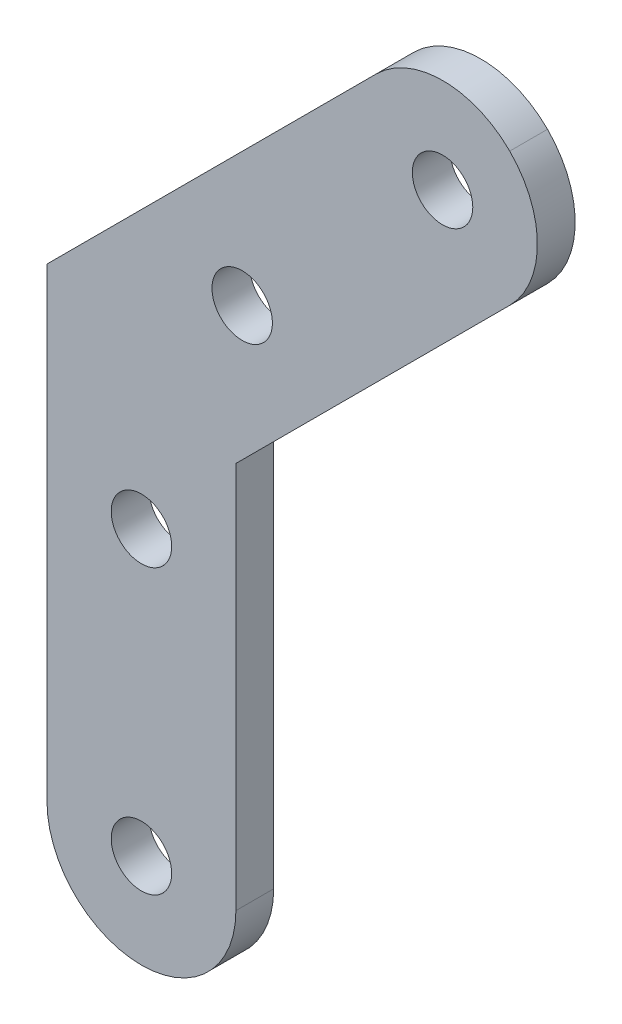
ISO-10303-21;
HEADER;
FILE_DESCRIPTION(('STEP AP214'),'2;1');
FILE_NAME('part.step','',(''),(''),'','','');
FILE_SCHEMA(('AUTOMOTIVE_DESIGN { 1 0 10303 214 1 1 1 1 }'));
ENDSEC;
DATA;
#1=APPLICATION_CONTEXT('core data for automotive mechanical design processes');
#2=APPLICATION_PROTOCOL_DEFINITION('international standard','automotive_design',2000,#1);
#3=PRODUCT_CONTEXT('',#1,'mechanical');
#4=PRODUCT('Part','Part','',(#3));
#5=PRODUCT_RELATED_PRODUCT_CATEGORY('part','',(#4));
#6=PRODUCT_DEFINITION_FORMATION('','',#4);
#7=PRODUCT_DEFINITION_CONTEXT('part definition',#1,'design');
#8=PRODUCT_DEFINITION('design','',#6,#7);
#9=PRODUCT_DEFINITION_SHAPE('','',#8);
#10=(LENGTH_UNIT() NAMED_UNIT(*) SI_UNIT(.MILLI.,.METRE.));
#11=(NAMED_UNIT(*) PLANE_ANGLE_UNIT() SI_UNIT($,.RADIAN.));
#12=(NAMED_UNIT(*) SI_UNIT($,.STERADIAN.) SOLID_ANGLE_UNIT());
#13=UNCERTAINTY_MEASURE_WITH_UNIT(LENGTH_MEASURE(1.E-05),#10,'distance_accuracy_value','');
#14=(GEOMETRIC_REPRESENTATION_CONTEXT(3) GLOBAL_UNCERTAINTY_ASSIGNED_CONTEXT((#13)) GLOBAL_UNIT_ASSIGNED_CONTEXT((#10,
#11,#12)) REPRESENTATION_CONTEXT('',''));
#15=CARTESIAN_POINT('',(0.,0.,0.));
#16=DIRECTION('',(0.,0.,1.));
#17=DIRECTION('',(1.,0.,0.));
#18=AXIS2_PLACEMENT_3D('',#15,#16,#17);
#19=CARTESIAN_POINT('',(-3.82785670531709,2.44699956093604,1.));
#20=DIRECTION('',(1.,0.,0.));
#21=DIRECTION('',(0.,1.,0.));
#22=AXIS2_PLACEMENT_3D('',#19,#20,#21);
#23=PLANE('',#22);
#24=DIRECTION('',(0.,-1.,0.));
#25=VECTOR('',#24,1.);
#26=CARTESIAN_POINT('',(-3.82785670531709,2.44699956093604,-1.));
#27=LINE('',#26,#25);
#28=CARTESIAN_POINT('',(-3.82785670531709,9.86493326428442,-1.));
#29=VERTEX_POINT('',#28);
#30=CARTESIAN_POINT('',(-3.82785670531708,-14.7772023594462,-1.));
#31=VERTEX_POINT('',#30);
#32=EDGE_CURVE('E130',#29,#31,#27,.T.);
#33=ORIENTED_EDGE('',*,*,#32,.T.);
#34=DIRECTION('',(0.,0.,-1.));
#35=VECTOR('',#34,1.);
#36=CARTESIAN_POINT('',(-3.82785670531708,-14.7772023594462,1.));
#37=LINE('',#36,#35);
#38=CARTESIAN_POINT('',(-3.82785670531708,-14.7772023594462,1.));
#39=VERTEX_POINT('',#38);
#40=EDGE_CURVE('E148',#31,#39,#37,.F.);
#41=ORIENTED_EDGE('',*,*,#40,.T.);
#42=DIRECTION('',(0.,-1.,0.));
#43=VECTOR('',#42,1.);
#44=CARTESIAN_POINT('',(-3.82785670531709,9.86493326428442,1.));
#45=LINE('',#44,#43);
#46=CARTESIAN_POINT('',(-3.82785670531709,9.86493326428442,1.));
#47=VERTEX_POINT('',#46);
#48=EDGE_CURVE('E109',#47,#39,#45,.T.);
#49=ORIENTED_EDGE('',*,*,#48,.F.);
#50=DIRECTION('',(0.,0.,-1.));
#51=VECTOR('',#50,1.);
#52=CARTESIAN_POINT('',(-3.82785670531709,9.86493326428442,1.));
#53=LINE('',#52,#51);
#54=EDGE_CURVE('E120',#47,#29,#53,.T.);
#55=ORIENTED_EDGE('',*,*,#54,.T.);
#56=EDGE_LOOP('',(#33,#41,#49,#55));
#57=FACE_BOUND('',#56,.T.);
#58=ADVANCED_FACE('F37',(#57),#23,.F.);
#59=CARTESIAN_POINT('',(6.17214329468292,-19.7772023594462,1.));
#60=DIRECTION('',(-1.,0.,0.));
#61=DIRECTION('',(0.,0.,1.));
#62=AXIS2_PLACEMENT_3D('',#59,#60,#61);
#63=PLANE('',#62);
#64=DIRECTION('',(0.,1.,0.));
#65=VECTOR('',#64,1.);
#66=CARTESIAN_POINT('',(6.17214329468292,-19.7772023594462,1.));
#67=LINE('',#66,#65);
#68=CARTESIAN_POINT('',(6.17214329468292,-14.7772023594462,1.));
#69=VERTEX_POINT('',#68);
#70=CARTESIAN_POINT('',(6.17214329468292,5.72279764055377,1.));
#71=VERTEX_POINT('',#70);
#72=EDGE_CURVE('E99',#69,#71,#67,.T.);
#73=ORIENTED_EDGE('',*,*,#72,.F.);
#74=DIRECTION('',(0.,0.,-1.));
#75=VECTOR('',#74,1.);
#76=CARTESIAN_POINT('',(6.17214329468292,-14.7772023594462,1.));
#77=LINE('',#76,#75);
#78=CARTESIAN_POINT('',(6.17214329468292,-14.7772023594462,-1.));
#79=VERTEX_POINT('',#78);
#80=EDGE_CURVE('E156',#69,#79,#77,.T.);
#81=ORIENTED_EDGE('',*,*,#80,.T.);
#82=DIRECTION('',(0.,1.,0.));
#83=VECTOR('',#82,1.);
#84=CARTESIAN_POINT('',(6.17214329468292,-19.7772023594462,-1.));
#85=LINE('',#84,#83);
#86=CARTESIAN_POINT('',(6.17214329468292,5.72279764055377,-1.));
#87=VERTEX_POINT('',#86);
#88=EDGE_CURVE('E115',#79,#87,#85,.T.);
#89=ORIENTED_EDGE('',*,*,#88,.T.);
#90=DIRECTION('',(0.,0.,-1.));
#91=VECTOR('',#90,1.);
#92=CARTESIAN_POINT('',(6.17214329468292,5.72279764055377,1.));
#93=LINE('',#92,#91);
#94=EDGE_CURVE('E112',#71,#87,#93,.T.);
#95=ORIENTED_EDGE('',*,*,#94,.F.);
#96=EDGE_LOOP('',(#73,#81,#89,#95));
#97=FACE_BOUND('',#96,.T.);
#98=ADVANCED_FACE('F113',(#97),#63,.F.);
#99=CARTESIAN_POINT('',(6.17214329468292,5.72279764055377,1.));
#100=DIRECTION('',(-0.707106781186547,0.707106781186547,0.));
#101=DIRECTION('',(-0.707106781186548,-0.707106781186548,0.));
#102=AXIS2_PLACEMENT_3D('',#99,#100,#101);
#103=PLANE('',#102);
#104=DIRECTION('',(0.707106781186548,0.707106781186548,0.));
#105=VECTOR('',#104,1.);
#106=CARTESIAN_POINT('',(6.17214329468292,5.72279764055377,-1.));
#107=LINE('',#106,#105);
#108=CARTESIAN_POINT('',(20.6678323090071,20.218486654878,-1.));
#109=VERTEX_POINT('',#108);
#110=EDGE_CURVE('E135',#87,#109,#107,.T.);
#111=ORIENTED_EDGE('',*,*,#110,.T.);
#112=DIRECTION('',(0.,0.,-1.));
#113=VECTOR('',#112,1.);
#114=CARTESIAN_POINT('',(20.6678323090071,20.218486654878,1.));
#115=LINE('',#114,#113);
#116=CARTESIAN_POINT('',(20.6678323090071,20.218486654878,1.));
#117=VERTEX_POINT('',#116);
#118=EDGE_CURVE('E46',#109,#117,#115,.F.);
#119=ORIENTED_EDGE('',*,*,#118,.T.);
#120=DIRECTION('',(0.707106781186548,0.707106781186548,0.));
#121=VECTOR('',#120,1.);
#122=CARTESIAN_POINT('',(6.17214329468292,5.72279764055377,1.));
#123=LINE('',#122,#121);
#124=EDGE_CURVE('E104',#71,#117,#123,.T.);
#125=ORIENTED_EDGE('',*,*,#124,.F.);
#126=ORIENTED_EDGE('',*,*,#94,.T.);
#127=EDGE_LOOP('',(#111,#119,#125,#126));
#128=FACE_BOUND('',#127,.T.);
#129=ADVANCED_FACE('F123',(#128),#103,.F.);
#130=CARTESIAN_POINT('',(17.1322984030744,30.8250883726762,1.));
#131=DIRECTION('',(0.707106781186553,-0.707106781186543,0.));
#132=DIRECTION('',(0.707106781186543,0.707106781186553,0.));
#133=AXIS2_PLACEMENT_3D('',#130,#131,#132);
#134=PLANE('',#133);
#135=DIRECTION('',(-0.707106781186542,-0.707106781186553,0.));
#136=VECTOR('',#135,1.);
#137=CARTESIAN_POINT('',(17.1322984030744,30.8250883726762,1.));
#138=LINE('',#137,#136);
#139=CARTESIAN_POINT('',(13.5967644971417,27.2895544667434,1.));
#140=VERTEX_POINT('',#139);
#141=EDGE_CURVE('E125',#140,#47,#138,.T.);
#142=ORIENTED_EDGE('',*,*,#141,.F.);
#143=DIRECTION('',(0.,0.,-1.));
#144=VECTOR('',#143,1.);
#145=CARTESIAN_POINT('',(13.5967644971417,27.2895544667434,1.));
#146=LINE('',#145,#144);
#147=CARTESIAN_POINT('',(13.5967644971417,27.2895544667434,-1.));
#148=VERTEX_POINT('',#147);
#149=EDGE_CURVE('E11',#140,#148,#146,.T.);
#150=ORIENTED_EDGE('',*,*,#149,.T.);
#151=DIRECTION('',(-0.707106781186542,-0.707106781186553,0.));
#152=VECTOR('',#151,1.);
#153=CARTESIAN_POINT('',(17.1322984030744,30.8250883726762,-1.));
#154=LINE('',#153,#152);
#155=EDGE_CURVE('E137',#148,#29,#154,.T.);
#156=ORIENTED_EDGE('',*,*,#155,.T.);
#157=ORIENTED_EDGE('',*,*,#54,.F.);
#158=EDGE_LOOP('',(#142,#150,#156,#157));
#159=FACE_BOUND('',#158,.T.);
#160=ADVANCED_FACE('F221',(#159),#134,.F.);
#161=CARTESIAN_POINT('',(0.,0.,1.));
#162=DIRECTION('',(0.,0.,1.));
#163=DIRECTION('',(1.,0.,0.));
#164=AXIS2_PLACEMENT_3D('',#161,#162,#163);
#165=PLANE('',#164);
#166=CARTESIAN_POINT('',(17.1117624086224,23.7334845663589,1.));
#167=DIRECTION('',(0.,0.,1.));
#168=DIRECTION('',(1.,0.,0.));
#169=AXIS2_PLACEMENT_3D('',#166,#167,#168);
#170=CIRCLE('',#169,1.6);
#171=CARTESIAN_POINT('',(18.7117624086224,23.7334845663589,1.));
#172=VERTEX_POINT('',#171);
#173=EDGE_CURVE('E168',#172,#172,#170,.T.);
#174=ORIENTED_EDGE('',*,*,#173,.F.);
#175=EDGE_LOOP('',(#174));
#176=FACE_BOUND('',#175,.T.);
#177=CARTESIAN_POINT('',(6.50516069082427,13.1268828485606,1.));
#178=DIRECTION('',(0.,0.,1.));
#179=DIRECTION('',(1.,0.,0.));
#180=AXIS2_PLACEMENT_3D('',#177,#178,#179);
#181=CIRCLE('',#180,1.6);
#182=CARTESIAN_POINT('',(8.10516069082428,13.1268828485606,1.));
#183=VERTEX_POINT('',#182);
#184=EDGE_CURVE('E173',#183,#183,#181,.T.);
#185=ORIENTED_EDGE('',*,*,#184,.F.);
#186=EDGE_LOOP('',(#185));
#187=FACE_BOUND('',#186,.T.);
#188=CARTESIAN_POINT('',(1.17214329468292,0.222797640553773,1.));
#189=DIRECTION('',(0.,0.,1.));
#190=DIRECTION('',(1.,0.,0.));
#191=AXIS2_PLACEMENT_3D('',#188,#189,#190);
#192=CIRCLE('',#191,1.6);
#193=CARTESIAN_POINT('',(2.77214329468292,0.222797640553773,1.));
#194=VERTEX_POINT('',#193);
#195=EDGE_CURVE('E181',#194,#194,#192,.T.);
#196=ORIENTED_EDGE('',*,*,#195,.F.);
#197=EDGE_LOOP('',(#196));
#198=FACE_BOUND('',#197,.T.);
#199=CARTESIAN_POINT('',(1.17214329468292,-14.7772023594462,1.));
#200=DIRECTION('',(0.,0.,1.));
#201=DIRECTION('',(1.,0.,0.));
#202=AXIS2_PLACEMENT_3D('',#199,#200,#201);
#203=CIRCLE('',#202,1.6);
#204=CARTESIAN_POINT('',(2.77214329468292,-14.7772023594462,1.));
#205=VERTEX_POINT('',#204);
#206=EDGE_CURVE('E187',#205,#205,#203,.T.);
#207=ORIENTED_EDGE('',*,*,#206,.F.);
#208=EDGE_LOOP('',(#207));
#209=FACE_BOUND('',#208,.T.);
#210=ORIENTED_EDGE('',*,*,#48,.T.);
#211=CARTESIAN_POINT('',(1.17214329468292,-14.7772023594462,1.));
#212=DIRECTION('',(0.,0.,1.));
#213=DIRECTION('',(1.,0.,0.));
#214=AXIS2_PLACEMENT_3D('',#211,#212,#213);
#215=CIRCLE('',#214,5.);
#216=CARTESIAN_POINT('',(1.17214329468292,-19.7772023594462,1.));
#217=VERTEX_POINT('',#216);
#218=EDGE_CURVE('E154',#39,#217,#215,.T.);
#219=ORIENTED_EDGE('',*,*,#218,.T.);
#220=CARTESIAN_POINT('',(1.17214329468292,-14.7772023594462,1.));
#221=DIRECTION('',(0.,0.,1.));
#222=DIRECTION('',(1.,0.,0.));
#223=AXIS2_PLACEMENT_3D('',#220,#221,#222);
#224=CIRCLE('',#223,5.);
#225=EDGE_CURVE('E106',#217,#69,#224,.T.);
#226=ORIENTED_EDGE('',*,*,#225,.T.);
#227=ORIENTED_EDGE('',*,*,#72,.T.);
#228=ORIENTED_EDGE('',*,*,#124,.T.);
#229=CARTESIAN_POINT('',(17.1322984030744,23.7540205608107,1.));
#230=DIRECTION('',(0.,0.,1.));
#231=DIRECTION('',(1.,0.,0.));
#232=AXIS2_PLACEMENT_3D('',#229,#230,#231);
#233=CIRCLE('',#232,5.);
#234=CARTESIAN_POINT('',(20.6678323090072,27.2895544667434,1.));
#235=VERTEX_POINT('',#234);
#236=EDGE_CURVE('E59',#117,#235,#233,.T.);
#237=ORIENTED_EDGE('',*,*,#236,.T.);
#238=CARTESIAN_POINT('',(17.1322984030744,23.7540205608107,1.));
#239=DIRECTION('',(0.,0.,1.));
#240=DIRECTION('',(1.,0.,0.));
#241=AXIS2_PLACEMENT_3D('',#238,#239,#240);
#242=CIRCLE('',#241,5.);
#243=EDGE_CURVE('E54',#235,#140,#242,.T.);
#244=ORIENTED_EDGE('',*,*,#243,.T.);
#245=ORIENTED_EDGE('',*,*,#141,.T.);
#246=EDGE_LOOP('',(#210,#219,#226,#227,#228,#237,#244,#245));
#247=FACE_BOUND('',#246,.T.);
#248=ADVANCED_FACE('F102',(#176,#187,#198,#209,#247),#165,.T.);
#249=CARTESIAN_POINT('',(0.,0.,-1.));
#250=DIRECTION('',(0.,0.,1.));
#251=DIRECTION('',(1.,0.,0.));
#252=AXIS2_PLACEMENT_3D('',#249,#250,#251);
#253=PLANE('',#252);
#254=CARTESIAN_POINT('',(17.1117624086224,23.7334845663589,-1.));
#255=DIRECTION('',(0.,0.,1.));
#256=DIRECTION('',(1.,0.,0.));
#257=AXIS2_PLACEMENT_3D('',#254,#255,#256);
#258=CIRCLE('',#257,1.6);
#259=CARTESIAN_POINT('',(18.7117624086224,23.7334845663589,-1.));
#260=VERTEX_POINT('',#259);
#261=EDGE_CURVE('E163',#260,#260,#258,.T.);
#262=ORIENTED_EDGE('',*,*,#261,.T.);
#263=EDGE_LOOP('',(#262));
#264=FACE_BOUND('',#263,.T.);
#265=CARTESIAN_POINT('',(6.50516069082427,13.1268828485606,-1.));
#266=DIRECTION('',(0.,0.,1.));
#267=DIRECTION('',(1.,0.,0.));
#268=AXIS2_PLACEMENT_3D('',#265,#266,#267);
#269=CIRCLE('',#268,1.6);
#270=CARTESIAN_POINT('',(8.10516069082428,13.1268828485606,-1.));
#271=VERTEX_POINT('',#270);
#272=EDGE_CURVE('E178',#271,#271,#269,.T.);
#273=ORIENTED_EDGE('',*,*,#272,.T.);
#274=EDGE_LOOP('',(#273));
#275=FACE_BOUND('',#274,.T.);
#276=CARTESIAN_POINT('',(1.17214329468292,0.222797640553773,-1.));
#277=DIRECTION('',(0.,0.,1.));
#278=DIRECTION('',(1.,0.,0.));
#279=AXIS2_PLACEMENT_3D('',#276,#277,#278);
#280=CIRCLE('',#279,1.6);
#281=CARTESIAN_POINT('',(2.77214329468292,0.222797640553773,-1.));
#282=VERTEX_POINT('',#281);
#283=EDGE_CURVE('E184',#282,#282,#280,.T.);
#284=ORIENTED_EDGE('',*,*,#283,.T.);
#285=EDGE_LOOP('',(#284));
#286=FACE_BOUND('',#285,.T.);
#287=CARTESIAN_POINT('',(1.17214329468292,-14.7772023594462,-1.));
#288=DIRECTION('',(0.,0.,1.));
#289=DIRECTION('',(1.,0.,0.));
#290=AXIS2_PLACEMENT_3D('',#287,#288,#289);
#291=CIRCLE('',#290,1.6);
#292=CARTESIAN_POINT('',(2.77214329468292,-14.7772023594462,-1.));
#293=VERTEX_POINT('',#292);
#294=EDGE_CURVE('E190',#293,#293,#291,.T.);
#295=ORIENTED_EDGE('',*,*,#294,.T.);
#296=EDGE_LOOP('',(#295));
#297=FACE_BOUND('',#296,.T.);
#298=CARTESIAN_POINT('',(1.17214329468292,-14.7772023594462,-1.));
#299=DIRECTION('',(0.,0.,1.));
#300=DIRECTION('',(1.,0.,0.));
#301=AXIS2_PLACEMENT_3D('',#298,#299,#300);
#302=CIRCLE('',#301,5.);
#303=CARTESIAN_POINT('',(1.17214329468292,-19.7772023594462,-1.));
#304=VERTEX_POINT('',#303);
#305=EDGE_CURVE('E144',#79,#304,#302,.F.);
#306=ORIENTED_EDGE('',*,*,#305,.T.);
#307=CARTESIAN_POINT('',(1.17214329468292,-14.7772023594462,-1.));
#308=DIRECTION('',(0.,0.,1.));
#309=DIRECTION('',(1.,0.,0.));
#310=AXIS2_PLACEMENT_3D('',#307,#308,#309);
#311=CIRCLE('',#310,5.);
#312=EDGE_CURVE('E146',#304,#31,#311,.F.);
#313=ORIENTED_EDGE('',*,*,#312,.T.);
#314=ORIENTED_EDGE('',*,*,#32,.F.);
#315=ORIENTED_EDGE('',*,*,#155,.F.);
#316=CARTESIAN_POINT('',(17.1322984030744,23.7540205608107,-1.));
#317=DIRECTION('',(0.,0.,1.));
#318=DIRECTION('',(1.,0.,0.));
#319=AXIS2_PLACEMENT_3D('',#316,#317,#318);
#320=CIRCLE('',#319,5.);
#321=CARTESIAN_POINT('',(20.6678323090072,27.2895544667434,-1.));
#322=VERTEX_POINT('',#321);
#323=EDGE_CURVE('E119',#148,#322,#320,.F.);
#324=ORIENTED_EDGE('',*,*,#323,.T.);
#325=CARTESIAN_POINT('',(17.1322984030744,23.7540205608107,-1.));
#326=DIRECTION('',(0.,0.,1.));
#327=DIRECTION('',(1.,0.,0.));
#328=AXIS2_PLACEMENT_3D('',#325,#326,#327);
#329=CIRCLE('',#328,5.);
#330=EDGE_CURVE('E142',#322,#109,#329,.F.);
#331=ORIENTED_EDGE('',*,*,#330,.T.);
#332=ORIENTED_EDGE('',*,*,#110,.F.);
#333=ORIENTED_EDGE('',*,*,#88,.F.);
#334=EDGE_LOOP('',(#306,#313,#314,#315,#324,#331,#332,#333));
#335=FACE_BOUND('',#334,.T.);
#336=ADVANCED_FACE('F199',(#264,#275,#286,#297,#335),#253,.F.);
#337=CARTESIAN_POINT('',(1.17214329468292,-14.7772023594462,1.));
#338=DIRECTION('',(0.,0.,-1.));
#339=DIRECTION('',(-1.,0.,0.));
#340=AXIS2_PLACEMENT_3D('',#337,#338,#339);
#341=CYLINDRICAL_SURFACE('',#340,5.);
#342=ORIENTED_EDGE('',*,*,#80,.F.);
#343=ORIENTED_EDGE('',*,*,#225,.F.);
#344=DIRECTION('',(0.,0.,-1.));
#345=VECTOR('',#344,1.);
#346=CARTESIAN_POINT('',(1.17214329468292,-19.7772023594462,1.));
#347=LINE('',#346,#345);
#348=EDGE_CURVE('E133',#304,#217,#347,.F.);
#349=ORIENTED_EDGE('',*,*,#348,.F.);
#350=ORIENTED_EDGE('',*,*,#305,.F.);
#351=EDGE_LOOP('',(#342,#343,#349,#350));
#352=FACE_BOUND('',#351,.T.);
#353=ADVANCED_FACE('F203',(#352),#341,.T.);
#354=CARTESIAN_POINT('',(1.17214329468292,-14.7772023594462,1.));
#355=DIRECTION('',(0.,0.,-1.));
#356=DIRECTION('',(-1.,0.,0.));
#357=AXIS2_PLACEMENT_3D('',#354,#355,#356);
#358=CYLINDRICAL_SURFACE('',#357,5.);
#359=ORIENTED_EDGE('',*,*,#218,.F.);
#360=ORIENTED_EDGE('',*,*,#40,.F.);
#361=ORIENTED_EDGE('',*,*,#312,.F.);
#362=ORIENTED_EDGE('',*,*,#348,.T.);
#363=EDGE_LOOP('',(#359,#360,#361,#362));
#364=FACE_BOUND('',#363,.T.);
#365=ADVANCED_FACE('F197',(#364),#358,.T.);
#366=CARTESIAN_POINT('',(17.1322984030744,23.7540205608107,1.));
#367=DIRECTION('',(0.,0.,-1.));
#368=DIRECTION('',(-1.,0.,0.));
#369=AXIS2_PLACEMENT_3D('',#366,#367,#368);
#370=CYLINDRICAL_SURFACE('',#369,5.);
#371=ORIENTED_EDGE('',*,*,#149,.F.);
#372=ORIENTED_EDGE('',*,*,#243,.F.);
#373=DIRECTION('',(0.,0.,-1.));
#374=VECTOR('',#373,1.);
#375=CARTESIAN_POINT('',(20.6678323090072,27.2895544667434,1.));
#376=LINE('',#375,#374);
#377=EDGE_CURVE('E41',#322,#235,#376,.F.);
#378=ORIENTED_EDGE('',*,*,#377,.F.);
#379=ORIENTED_EDGE('',*,*,#323,.F.);
#380=EDGE_LOOP('',(#371,#372,#378,#379));
#381=FACE_BOUND('',#380,.T.);
#382=ADVANCED_FACE('F39',(#381),#370,.T.);
#383=CARTESIAN_POINT('',(17.1322984030744,23.7540205608107,1.));
#384=DIRECTION('',(0.,0.,-1.));
#385=DIRECTION('',(-1.,0.,0.));
#386=AXIS2_PLACEMENT_3D('',#383,#384,#385);
#387=CYLINDRICAL_SURFACE('',#386,5.);
#388=ORIENTED_EDGE('',*,*,#236,.F.);
#389=ORIENTED_EDGE('',*,*,#118,.F.);
#390=ORIENTED_EDGE('',*,*,#330,.F.);
#391=ORIENTED_EDGE('',*,*,#377,.T.);
#392=EDGE_LOOP('',(#388,#389,#390,#391));
#393=FACE_BOUND('',#392,.T.);
#394=ADVANCED_FACE('F232',(#393),#387,.T.);
#395=CARTESIAN_POINT('',(1.17214329468292,-14.7772023594462,-1.));
#396=DIRECTION('',(0.,0.,1.));
#397=DIRECTION('',(1.,0.,0.));
#398=AXIS2_PLACEMENT_3D('',#395,#396,#397);
#399=CYLINDRICAL_SURFACE('',#398,1.6);
#400=ORIENTED_EDGE('',*,*,#294,.F.);
#401=EDGE_LOOP('',(#400));
#402=FACE_BOUND('',#401,.T.);
#403=ORIENTED_EDGE('',*,*,#206,.T.);
#404=EDGE_LOOP('',(#403));
#405=FACE_BOUND('',#404,.T.);
#406=ADVANCED_FACE('F228',(#402,#405),#399,.F.);
#407=CARTESIAN_POINT('',(1.17214329468292,0.222797640553773,-1.));
#408=DIRECTION('',(0.,0.,1.));
#409=DIRECTION('',(1.,0.,0.));
#410=AXIS2_PLACEMENT_3D('',#407,#408,#409);
#411=CYLINDRICAL_SURFACE('',#410,1.6);
#412=ORIENTED_EDGE('',*,*,#283,.F.);
#413=EDGE_LOOP('',(#412));
#414=FACE_BOUND('',#413,.T.);
#415=ORIENTED_EDGE('',*,*,#195,.T.);
#416=EDGE_LOOP('',(#415));
#417=FACE_BOUND('',#416,.T.);
#418=ADVANCED_FACE('F231',(#414,#417),#411,.F.);
#419=CARTESIAN_POINT('',(6.50516069082427,13.1268828485606,-1.));
#420=DIRECTION('',(0.,0.,1.));
#421=DIRECTION('',(1.,0.,0.));
#422=AXIS2_PLACEMENT_3D('',#419,#420,#421);
#423=CYLINDRICAL_SURFACE('',#422,1.6);
#424=ORIENTED_EDGE('',*,*,#272,.F.);
#425=EDGE_LOOP('',(#424));
#426=FACE_BOUND('',#425,.T.);
#427=ORIENTED_EDGE('',*,*,#184,.T.);
#428=EDGE_LOOP('',(#427));
#429=FACE_BOUND('',#428,.T.);
#430=ADVANCED_FACE('F236',(#426,#429),#423,.F.);
#431=CARTESIAN_POINT('',(17.1117624086224,23.7334845663589,-1.));
#432=DIRECTION('',(0.,0.,1.));
#433=DIRECTION('',(1.,0.,0.));
#434=AXIS2_PLACEMENT_3D('',#431,#432,#433);
#435=CYLINDRICAL_SURFACE('',#434,1.6);
#436=ORIENTED_EDGE('',*,*,#261,.F.);
#437=EDGE_LOOP('',(#436));
#438=FACE_BOUND('',#437,.T.);
#439=ORIENTED_EDGE('',*,*,#173,.T.);
#440=EDGE_LOOP('',(#439));
#441=FACE_BOUND('',#440,.T.);
#442=ADVANCED_FACE('F240',(#438,#441),#435,.F.);
#443=CLOSED_SHELL('',(#58,#98,#129,#160,#248,#336,#353,#365,#382,#394,#406,#418,#430,#442));
#444=MANIFOLD_SOLID_BREP('B2',#443);
#445=ADVANCED_BREP_SHAPE_REPRESENTATION('',(#18,#444),#14);
#446=SHAPE_DEFINITION_REPRESENTATION(#9,#445);
ENDSEC;
END-ISO-10303-21;
